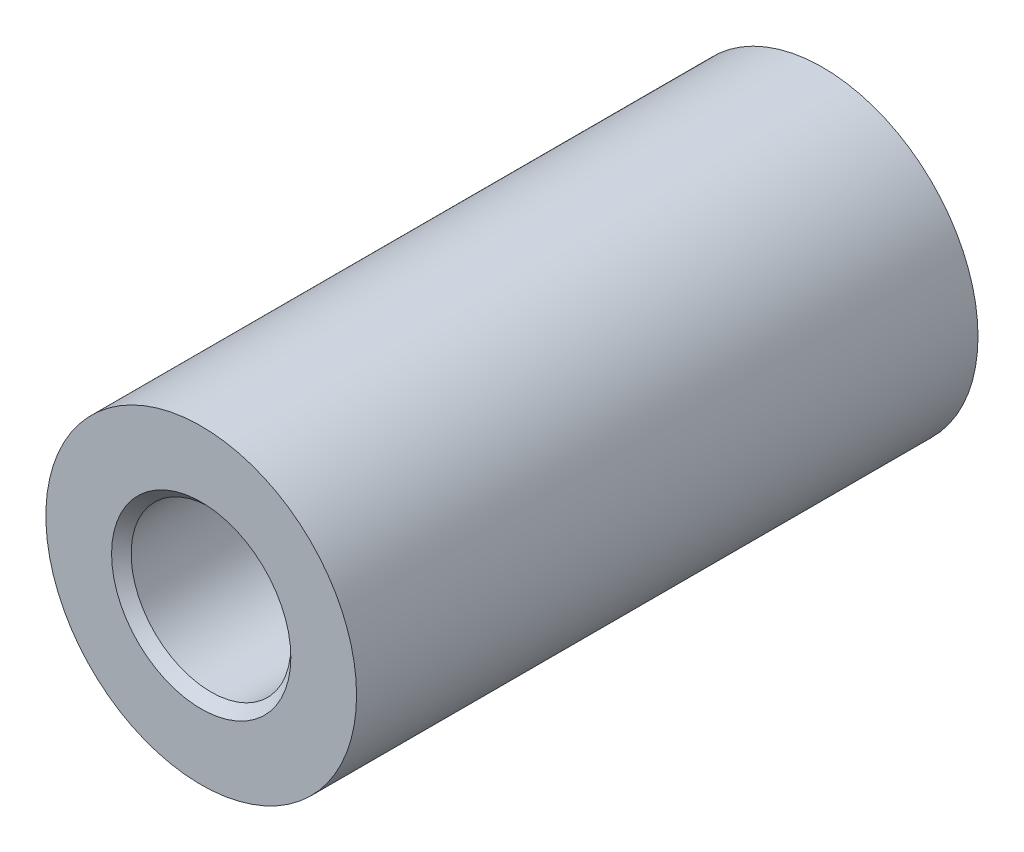
ISO-10303-21;
HEADER;
FILE_DESCRIPTION(('STEP AP214'),'2;1');
FILE_NAME('part.step','',(''),(''),'','','');
FILE_SCHEMA(('AUTOMOTIVE_DESIGN { 1 0 10303 214 1 1 1 1 }'));
ENDSEC;
DATA;
#1=APPLICATION_CONTEXT('core data for automotive mechanical design processes');
#2=APPLICATION_PROTOCOL_DEFINITION('international standard','automotive_design',2000,#1);
#3=PRODUCT_CONTEXT('',#1,'mechanical');
#4=PRODUCT('Part','Part','',(#3));
#5=PRODUCT_RELATED_PRODUCT_CATEGORY('part','',(#4));
#6=PRODUCT_DEFINITION_FORMATION('','',#4);
#7=PRODUCT_DEFINITION_CONTEXT('part definition',#1,'design');
#8=PRODUCT_DEFINITION('design','',#6,#7);
#9=PRODUCT_DEFINITION_SHAPE('','',#8);
#10=(LENGTH_UNIT() NAMED_UNIT(*) SI_UNIT(.MILLI.,.METRE.));
#11=(NAMED_UNIT(*) PLANE_ANGLE_UNIT() SI_UNIT($,.RADIAN.));
#12=(NAMED_UNIT(*) SI_UNIT($,.STERADIAN.) SOLID_ANGLE_UNIT());
#13=UNCERTAINTY_MEASURE_WITH_UNIT(LENGTH_MEASURE(1.E-05),#10,'distance_accuracy_value','');
#14=(GEOMETRIC_REPRESENTATION_CONTEXT(3) GLOBAL_UNCERTAINTY_ASSIGNED_CONTEXT((#13)) GLOBAL_UNIT_ASSIGNED_CONTEXT((#10,
#11,#12)) REPRESENTATION_CONTEXT('',''));
#15=CARTESIAN_POINT('',(0.,0.,0.));
#16=DIRECTION('',(0.,0.,1.));
#17=DIRECTION('',(1.,0.,0.));
#18=AXIS2_PLACEMENT_3D('',#15,#16,#17);
#19=CARTESIAN_POINT('',(0.,0.,25.4));
#20=DIRECTION('',(0.,0.,-1.));
#21=DIRECTION('',(-1.,0.,0.));
#22=AXIS2_PLACEMENT_3D('',#19,#20,#21);
#23=CYLINDRICAL_SURFACE('',#22,6.35);
#24=CARTESIAN_POINT('',(0.,0.,25.4));
#25=DIRECTION('',(0.,0.,1.));
#26=DIRECTION('',(1.,0.,0.));
#27=AXIS2_PLACEMENT_3D('',#24,#25,#26);
#28=CIRCLE('',#27,6.35);
#29=CARTESIAN_POINT('',(6.35,0.,25.4));
#30=VERTEX_POINT('',#29);
#31=EDGE_CURVE('E51',#30,#30,#28,.T.);
#32=ORIENTED_EDGE('',*,*,#31,.F.);
#33=EDGE_LOOP('',(#32));
#34=FACE_BOUND('',#33,.T.);
#35=CARTESIAN_POINT('',(0.,0.,0.));
#36=DIRECTION('',(0.,0.,1.));
#37=DIRECTION('',(1.,0.,0.));
#38=AXIS2_PLACEMENT_3D('',#35,#36,#37);
#39=CIRCLE('',#38,6.35);
#40=CARTESIAN_POINT('',(6.35,0.,0.));
#41=VERTEX_POINT('',#40);
#42=EDGE_CURVE('E52',#41,#41,#39,.T.);
#43=ORIENTED_EDGE('',*,*,#42,.T.);
#44=EDGE_LOOP('',(#43));
#45=FACE_BOUND('',#44,.T.);
#46=ADVANCED_FACE('F31',(#34,#45),#23,.T.);
#47=CARTESIAN_POINT('',(0.,0.,25.4));
#48=DIRECTION('',(0.,0.,1.));
#49=DIRECTION('',(1.,0.,0.));
#50=AXIS2_PLACEMENT_3D('',#47,#48,#49);
#51=PLANE('',#50);
#52=CARTESIAN_POINT('',(0.,0.,25.4));
#53=DIRECTION('',(0.,0.,1.));
#54=DIRECTION('',(1.,0.,0.));
#55=AXIS2_PLACEMENT_3D('',#52,#53,#54);
#56=CIRCLE('',#55,3.66389999999999);
#57=CARTESIAN_POINT('',(3.66389999999999,0.,25.4));
#58=VERTEX_POINT('',#57);
#59=EDGE_CURVE('E10',#58,#58,#56,.F.);
#60=ORIENTED_EDGE('',*,*,#59,.T.);
#61=EDGE_LOOP('',(#60));
#62=FACE_BOUND('',#61,.T.);
#63=ORIENTED_EDGE('',*,*,#31,.T.);
#64=EDGE_LOOP('',(#63));
#65=FACE_BOUND('',#64,.T.);
#66=ADVANCED_FACE('F58',(#62,#65),#51,.T.);
#67=CARTESIAN_POINT('',(0.,0.,0.));
#68=DIRECTION('',(0.,0.,1.));
#69=DIRECTION('',(1.,0.,0.));
#70=AXIS2_PLACEMENT_3D('',#67,#68,#69);
#71=PLANE('',#70);
#72=CARTESIAN_POINT('',(0.,0.,0.));
#73=DIRECTION('',(0.,0.,1.));
#74=DIRECTION('',(1.,0.,0.));
#75=AXIS2_PLACEMENT_3D('',#72,#73,#74);
#76=CIRCLE('',#75,3.6639);
#77=CARTESIAN_POINT('',(3.6639,0.,0.));
#78=VERTEX_POINT('',#77);
#79=EDGE_CURVE('E46',#78,#78,#76,.T.);
#80=ORIENTED_EDGE('',*,*,#79,.T.);
#81=EDGE_LOOP('',(#80));
#82=FACE_BOUND('',#81,.T.);
#83=ORIENTED_EDGE('',*,*,#42,.F.);
#84=EDGE_LOOP('',(#83));
#85=FACE_BOUND('',#84,.T.);
#86=ADVANCED_FACE('F65',(#82,#85),#71,.F.);
#87=CARTESIAN_POINT('',(0.,0.,25.4));
#88=DIRECTION('',(0.,0.,1.));
#89=DIRECTION('',(1.,0.,0.));
#90=AXIS2_PLACEMENT_3D('',#87,#88,#89);
#91=CYLINDRICAL_SURFACE('',#90,3.26389999999999);
#92=CARTESIAN_POINT('',(0.,0.,0.400000000000011));
#93=DIRECTION('',(0.,0.,1.));
#94=DIRECTION('',(1.,0.,0.));
#95=AXIS2_PLACEMENT_3D('',#92,#93,#94);
#96=CIRCLE('',#95,3.26389999999999);
#97=CARTESIAN_POINT('',(3.26389999999999,0.,0.400000000000011));
#98=VERTEX_POINT('',#97);
#99=EDGE_CURVE('E38',#98,#98,#96,.F.);
#100=ORIENTED_EDGE('',*,*,#99,.T.);
#101=EDGE_LOOP('',(#100));
#102=FACE_BOUND('',#101,.T.);
#103=CARTESIAN_POINT('',(0.,0.,25.));
#104=DIRECTION('',(0.,0.,1.));
#105=DIRECTION('',(1.,0.,0.));
#106=AXIS2_PLACEMENT_3D('',#103,#104,#105);
#107=CIRCLE('',#106,3.26389999999999);
#108=CARTESIAN_POINT('',(3.26389999999999,0.,25.));
#109=VERTEX_POINT('',#108);
#110=EDGE_CURVE('E42',#109,#109,#107,.T.);
#111=ORIENTED_EDGE('',*,*,#110,.T.);
#112=EDGE_LOOP('',(#111));
#113=FACE_BOUND('',#112,.T.);
#114=ADVANCED_FACE('F67',(#102,#113),#91,.F.);
#115=CARTESIAN_POINT('',(0.,0.,0.));
#116=DIRECTION('',(0.,0.,-1.));
#117=DIRECTION('',(-1.,0.,0.));
#118=AXIS2_PLACEMENT_3D('',#115,#116,#117);
#119=CONICAL_SURFACE('',#118,3.6639,0.785398163397441);
#120=ORIENTED_EDGE('',*,*,#99,.F.);
#121=EDGE_LOOP('',(#120));
#122=FACE_BOUND('',#121,.T.);
#123=ORIENTED_EDGE('',*,*,#79,.F.);
#124=EDGE_LOOP('',(#123));
#125=FACE_BOUND('',#124,.T.);
#126=ADVANCED_FACE('F74',(#122,#125),#119,.F.);
#127=CARTESIAN_POINT('',(0.,0.,25.));
#128=DIRECTION('',(0.,0.,1.));
#129=DIRECTION('',(1.,0.,0.));
#130=AXIS2_PLACEMENT_3D('',#127,#128,#129);
#131=CONICAL_SURFACE('',#130,3.26389999999999,0.785398163397451);
#132=ORIENTED_EDGE('',*,*,#59,.F.);
#133=EDGE_LOOP('',(#132));
#134=FACE_BOUND('',#133,.T.);
#135=ORIENTED_EDGE('',*,*,#110,.F.);
#136=EDGE_LOOP('',(#135));
#137=FACE_BOUND('',#136,.T.);
#138=ADVANCED_FACE('F33',(#134,#137),#131,.F.);
#139=CLOSED_SHELL('',(#46,#66,#86,#114,#126,#138));
#140=MANIFOLD_SOLID_BREP('B2',#139);
#141=ADVANCED_BREP_SHAPE_REPRESENTATION('',(#18,#140),#14);
#142=SHAPE_DEFINITION_REPRESENTATION(#9,#141);
ENDSEC;
END-ISO-10303-21;
